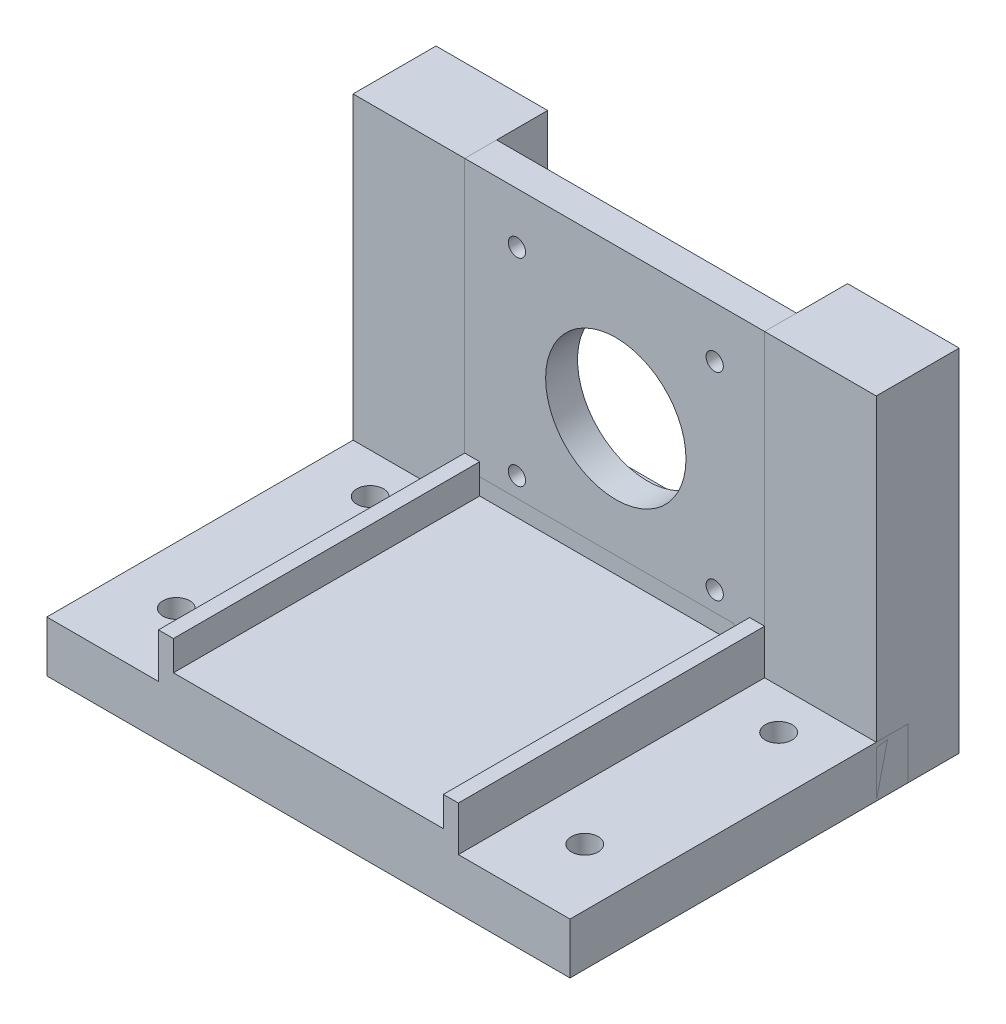
ISO-10303-21;
HEADER;
FILE_DESCRIPTION(('STEP AP214'),'2;1');
FILE_NAME('part.step','',(''),(''),'','','');
FILE_SCHEMA(('AUTOMOTIVE_DESIGN { 1 0 10303 214 1 1 1 1 }'));
ENDSEC;
DATA;
#1=APPLICATION_CONTEXT('core data for automotive mechanical design processes');
#2=APPLICATION_PROTOCOL_DEFINITION('international standard','automotive_design',2000,#1);
#3=PRODUCT_CONTEXT('',#1,'mechanical');
#4=PRODUCT('Part','Part','',(#3));
#5=PRODUCT_RELATED_PRODUCT_CATEGORY('part','',(#4));
#6=PRODUCT_DEFINITION_FORMATION('','',#4);
#7=PRODUCT_DEFINITION_CONTEXT('part definition',#1,'design');
#8=PRODUCT_DEFINITION('design','',#6,#7);
#9=PRODUCT_DEFINITION_SHAPE('','',#8);
#10=(LENGTH_UNIT() NAMED_UNIT(*) SI_UNIT(.MILLI.,.METRE.));
#11=(NAMED_UNIT(*) PLANE_ANGLE_UNIT() SI_UNIT($,.RADIAN.));
#12=(NAMED_UNIT(*) SI_UNIT($,.STERADIAN.) SOLID_ANGLE_UNIT());
#13=UNCERTAINTY_MEASURE_WITH_UNIT(LENGTH_MEASURE(1.E-05),#10,'distance_accuracy_value','');
#14=(GEOMETRIC_REPRESENTATION_CONTEXT(3) GLOBAL_UNCERTAINTY_ASSIGNED_CONTEXT((#13)) GLOBAL_UNIT_ASSIGNED_CONTEXT((#10,
#11,#12)) REPRESENTATION_CONTEXT('',''));
#15=CARTESIAN_POINT('',(0.,0.,0.));
#16=DIRECTION('',(0.,0.,1.));
#17=DIRECTION('',(1.,0.,0.));
#18=AXIS2_PLACEMENT_3D('',#15,#16,#17);
#19=CARTESIAN_POINT('',(0.,0.,-8.));
#20=DIRECTION('',(0.,0.,-1.));
#21=DIRECTION('',(-1.,0.,0.));
#22=AXIS2_PLACEMENT_3D('',#19,#20,#21);
#23=PLANE('',#22);
#24=CARTESIAN_POINT('',(-32.25,-0.427350625354143,-8.));
#25=DIRECTION('',(0.,0.,-1.));
#26=DIRECTION('',(-1.,0.,0.));
#27=AXIS2_PLACEMENT_3D('',#24,#25,#26);
#28=CIRCLE('',#27,4.09999999999999);
#29=CARTESIAN_POINT('',(-36.35,-0.427350625354143,-8.));
#30=VERTEX_POINT('',#29);
#31=EDGE_CURVE('E144',#30,#30,#28,.F.);
#32=ORIENTED_EDGE('',*,*,#31,.T.);
#33=EDGE_LOOP('',(#32));
#34=FACE_BOUND('',#33,.T.);
#35=DIRECTION('',(0.,-1.,0.));
#36=VECTOR('',#35,1.);
#37=CARTESIAN_POINT('',(41.,0.,-8.));
#38=LINE('',#37,#36);
#39=CARTESIAN_POINT('',(41.,23.5,-8.));
#40=VERTEX_POINT('',#39);
#41=CARTESIAN_POINT('',(41.,-31.5,-8.));
#42=VERTEX_POINT('',#41);
#43=EDGE_CURVE('E120',#40,#42,#38,.T.);
#44=ORIENTED_EDGE('',*,*,#43,.T.);
#45=DIRECTION('',(-1.,0.,0.));
#46=VECTOR('',#45,1.);
#47=CARTESIAN_POINT('',(0.,-31.5,-8.));
#48=LINE('',#47,#46);
#49=CARTESIAN_POINT('',(-41.,-31.5,-8.));
#50=VERTEX_POINT('',#49);
#51=EDGE_CURVE('E127',#42,#50,#48,.T.);
#52=ORIENTED_EDGE('',*,*,#51,.T.);
#53=DIRECTION('',(0.,1.,0.));
#54=VECTOR('',#53,1.);
#55=CARTESIAN_POINT('',(-41.,0.,-8.));
#56=LINE('',#55,#54);
#57=CARTESIAN_POINT('',(-41.,23.5,-8.));
#58=VERTEX_POINT('',#57);
#59=EDGE_CURVE('E133',#50,#58,#56,.T.);
#60=ORIENTED_EDGE('',*,*,#59,.T.);
#61=DIRECTION('',(-1.,0.,0.));
#62=VECTOR('',#61,1.);
#63=CARTESIAN_POINT('',(0.,23.5,-8.));
#64=LINE('',#63,#62);
#65=CARTESIAN_POINT('',(-23.5,23.5,-8.));
#66=VERTEX_POINT('',#65);
#67=EDGE_CURVE('E148',#66,#58,#64,.T.);
#68=ORIENTED_EDGE('',*,*,#67,.F.);
#69=DIRECTION('',(0.,1.,0.));
#70=VECTOR('',#69,1.);
#71=CARTESIAN_POINT('',(-23.5,0.,-8.));
#72=LINE('',#71,#70);
#73=CARTESIAN_POINT('',(-23.5,-18.5474793914732,-8.));
#74=VERTEX_POINT('',#73);
#75=EDGE_CURVE('E151',#74,#66,#72,.T.);
#76=ORIENTED_EDGE('',*,*,#75,.F.);
#77=DIRECTION('',(-1.,0.,0.));
#78=VECTOR('',#77,1.);
#79=CARTESIAN_POINT('',(0.,-18.5474793914732,-8.));
#80=LINE('',#79,#78);
#81=CARTESIAN_POINT('',(23.5,-18.5474793914732,-8.));
#82=VERTEX_POINT('',#81);
#83=EDGE_CURVE('E154',#82,#74,#80,.T.);
#84=ORIENTED_EDGE('',*,*,#83,.F.);
#85=DIRECTION('',(0.,-1.,0.));
#86=VECTOR('',#85,1.);
#87=CARTESIAN_POINT('',(23.5,0.,-8.));
#88=LINE('',#87,#86);
#89=CARTESIAN_POINT('',(23.5,23.5,-8.));
#90=VERTEX_POINT('',#89);
#91=EDGE_CURVE('E157',#90,#82,#88,.T.);
#92=ORIENTED_EDGE('',*,*,#91,.F.);
#93=DIRECTION('',(-1.,0.,0.));
#94=VECTOR('',#93,1.);
#95=CARTESIAN_POINT('',(0.,23.5,-8.));
#96=LINE('',#95,#94);
#97=EDGE_CURVE('E125',#40,#90,#96,.T.);
#98=ORIENTED_EDGE('',*,*,#97,.F.);
#99=EDGE_LOOP('',(#44,#52,#60,#68,#76,#84,#92,#98));
#100=FACE_BOUND('',#99,.T.);
#101=CARTESIAN_POINT('',(32.25,-0.42735062535415,-8.));
#102=DIRECTION('',(0.,0.,-1.));
#103=DIRECTION('',(-1.,0.,0.));
#104=AXIS2_PLACEMENT_3D('',#101,#102,#103);
#105=CIRCLE('',#104,4.1);
#106=CARTESIAN_POINT('',(28.15,-0.42735062535415,-8.));
#107=VERTEX_POINT('',#106);
#108=EDGE_CURVE('E141',#107,#107,#105,.T.);
#109=ORIENTED_EDGE('',*,*,#108,.F.);
#110=EDGE_LOOP('',(#109));
#111=FACE_BOUND('',#110,.T.);
#112=ADVANCED_FACE('F53',(#34,#100,#111),#23,.T.);
#113=CARTESIAN_POINT('',(41.,0.,103.737024463977));
#114=DIRECTION('',(1.,0.,0.));
#115=DIRECTION('',(0.,0.,-1.));
#116=AXIS2_PLACEMENT_3D('',#113,#114,#115);
#117=PLANE('',#116);
#118=DIRECTION('',(0.,1.,0.));
#119=VECTOR('',#118,1.);
#120=CARTESIAN_POINT('',(41.,0.,5.));
#121=LINE('',#120,#119);
#122=CARTESIAN_POINT('',(41.,-31.5,5.));
#123=VERTEX_POINT('',#122);
#124=CARTESIAN_POINT('',(41.,23.5,5.));
#125=VERTEX_POINT('',#124);
#126=EDGE_CURVE('E61',#123,#125,#121,.T.);
#127=ORIENTED_EDGE('',*,*,#126,.F.);
#128=DIRECTION('',(0.,0.,-1.));
#129=VECTOR('',#128,1.);
#130=CARTESIAN_POINT('',(41.,-31.5,103.737024463977));
#131=LINE('',#130,#129);
#132=EDGE_CURVE('E116',#123,#42,#131,.T.);
#133=ORIENTED_EDGE('',*,*,#132,.T.);
#134=ORIENTED_EDGE('',*,*,#43,.F.);
#135=DIRECTION('',(0.,0.,-1.));
#136=VECTOR('',#135,1.);
#137=CARTESIAN_POINT('',(41.,23.5,103.737024463977));
#138=LINE('',#137,#136);
#139=EDGE_CURVE('E163',#125,#40,#138,.T.);
#140=ORIENTED_EDGE('',*,*,#139,.F.);
#141=EDGE_LOOP('',(#127,#133,#134,#140));
#142=FACE_BOUND('',#141,.T.);
#143=ADVANCED_FACE('F55',(#142),#117,.T.);
#144=CARTESIAN_POINT('',(0.,23.5,103.737024463977));
#145=DIRECTION('',(0.,-1.,0.));
#146=DIRECTION('',(0.,0.,-1.));
#147=AXIS2_PLACEMENT_3D('',#144,#145,#146);
#148=PLANE('',#147);
#149=DIRECTION('',(0.,0.,-1.));
#150=VECTOR('',#149,1.);
#151=CARTESIAN_POINT('',(23.5,23.5,103.737024463977));
#152=LINE('',#151,#150);
#153=CARTESIAN_POINT('',(23.5,23.5,5.));
#154=VERTEX_POINT('',#153);
#155=EDGE_CURVE('E177',#154,#90,#152,.T.);
#156=ORIENTED_EDGE('',*,*,#155,.F.);
#157=DIRECTION('',(1.,0.,0.));
#158=VECTOR('',#157,1.);
#159=CARTESIAN_POINT('',(0.,23.5,5.));
#160=LINE('',#159,#158);
#161=EDGE_CURVE('E172',#154,#125,#160,.T.);
#162=ORIENTED_EDGE('',*,*,#161,.T.);
#163=ORIENTED_EDGE('',*,*,#139,.T.);
#164=ORIENTED_EDGE('',*,*,#97,.T.);
#165=EDGE_LOOP('',(#156,#162,#163,#164));
#166=FACE_BOUND('',#165,.T.);
#167=ADVANCED_FACE('F206',(#166),#148,.F.);
#168=CARTESIAN_POINT('',(23.5,0.,103.737024463977));
#169=DIRECTION('',(1.,0.,0.));
#170=DIRECTION('',(0.,0.,-1.));
#171=AXIS2_PLACEMENT_3D('',#168,#169,#170);
#172=PLANE('',#171);
#173=DIRECTION('',(0.,0.,-1.));
#174=VECTOR('',#173,1.);
#175=CARTESIAN_POINT('',(23.5,-18.5474793914732,103.737024463977));
#176=LINE('',#175,#174);
#177=CARTESIAN_POINT('',(23.5,-18.5474793914732,5.));
#178=VERTEX_POINT('',#177);
#179=EDGE_CURVE('E179',#178,#82,#176,.T.);
#180=ORIENTED_EDGE('',*,*,#179,.F.);
#181=DIRECTION('',(0.,1.,0.));
#182=VECTOR('',#181,1.);
#183=CARTESIAN_POINT('',(23.5,0.,5.));
#184=LINE('',#183,#182);
#185=EDGE_CURVE('E169',#178,#154,#184,.T.);
#186=ORIENTED_EDGE('',*,*,#185,.T.);
#187=ORIENTED_EDGE('',*,*,#155,.T.);
#188=ORIENTED_EDGE('',*,*,#91,.T.);
#189=EDGE_LOOP('',(#180,#186,#187,#188));
#190=FACE_BOUND('',#189,.T.);
#191=ADVANCED_FACE('F203',(#190),#172,.F.);
#192=CARTESIAN_POINT('',(0.,-18.5474793914732,103.737024463977));
#193=DIRECTION('',(0.,-1.,0.));
#194=DIRECTION('',(0.,0.,-1.));
#195=AXIS2_PLACEMENT_3D('',#192,#193,#194);
#196=PLANE('',#195);
#197=DIRECTION('',(0.,0.,-1.));
#198=VECTOR('',#197,1.);
#199=CARTESIAN_POINT('',(-23.5,-18.5474793914732,103.737024463977));
#200=LINE('',#199,#198);
#201=CARTESIAN_POINT('',(-23.5,-18.5474793914732,5.));
#202=VERTEX_POINT('',#201);
#203=EDGE_CURVE('E181',#202,#74,#200,.T.);
#204=ORIENTED_EDGE('',*,*,#203,.F.);
#205=DIRECTION('',(1.,0.,0.));
#206=VECTOR('',#205,1.);
#207=CARTESIAN_POINT('',(0.,-18.5474793914732,5.));
#208=LINE('',#207,#206);
#209=EDGE_CURVE('E166',#202,#178,#208,.T.);
#210=ORIENTED_EDGE('',*,*,#209,.T.);
#211=ORIENTED_EDGE('',*,*,#179,.T.);
#212=ORIENTED_EDGE('',*,*,#83,.T.);
#213=EDGE_LOOP('',(#204,#210,#211,#212));
#214=FACE_BOUND('',#213,.T.);
#215=ADVANCED_FACE('F200',(#214),#196,.F.);
#216=CARTESIAN_POINT('',(-23.5,0.,103.737024463977));
#217=DIRECTION('',(-1.,0.,0.));
#218=DIRECTION('',(0.,0.,1.));
#219=AXIS2_PLACEMENT_3D('',#216,#217,#218);
#220=PLANE('',#219);
#221=DIRECTION('',(0.,0.,-1.));
#222=VECTOR('',#221,1.);
#223=CARTESIAN_POINT('',(-23.5,23.5,103.737024463977));
#224=LINE('',#223,#222);
#225=CARTESIAN_POINT('',(-23.5,23.5,5.));
#226=VERTEX_POINT('',#225);
#227=EDGE_CURVE('E183',#226,#66,#224,.T.);
#228=ORIENTED_EDGE('',*,*,#227,.F.);
#229=DIRECTION('',(0.,-1.,0.));
#230=VECTOR('',#229,1.);
#231=CARTESIAN_POINT('',(-23.5,0.,5.));
#232=LINE('',#231,#230);
#233=EDGE_CURVE('E73',#226,#202,#232,.T.);
#234=ORIENTED_EDGE('',*,*,#233,.T.);
#235=ORIENTED_EDGE('',*,*,#203,.T.);
#236=ORIENTED_EDGE('',*,*,#75,.T.);
#237=EDGE_LOOP('',(#228,#234,#235,#236));
#238=FACE_BOUND('',#237,.T.);
#239=ADVANCED_FACE('F196',(#238),#220,.F.);
#240=CARTESIAN_POINT('',(0.,23.5,103.737024463977));
#241=DIRECTION('',(0.,-1.,0.));
#242=DIRECTION('',(0.,0.,-1.));
#243=AXIS2_PLACEMENT_3D('',#240,#241,#242);
#244=PLANE('',#243);
#245=DIRECTION('',(0.,0.,-1.));
#246=VECTOR('',#245,1.);
#247=CARTESIAN_POINT('',(-41.,23.5,103.737024463977));
#248=LINE('',#247,#246);
#249=CARTESIAN_POINT('',(-41.,23.5,5.));
#250=VERTEX_POINT('',#249);
#251=EDGE_CURVE('E185',#250,#58,#248,.T.);
#252=ORIENTED_EDGE('',*,*,#251,.F.);
#253=DIRECTION('',(1.,0.,0.));
#254=VECTOR('',#253,1.);
#255=CARTESIAN_POINT('',(0.,23.5,5.));
#256=LINE('',#255,#254);
#257=EDGE_CURVE('E68',#250,#226,#256,.T.);
#258=ORIENTED_EDGE('',*,*,#257,.T.);
#259=ORIENTED_EDGE('',*,*,#227,.T.);
#260=ORIENTED_EDGE('',*,*,#67,.T.);
#261=EDGE_LOOP('',(#252,#258,#259,#260));
#262=FACE_BOUND('',#261,.T.);
#263=ADVANCED_FACE('F193',(#262),#244,.F.);
#264=CARTESIAN_POINT('',(-41.,0.,103.737024463977));
#265=DIRECTION('',(-1.,0.,0.));
#266=DIRECTION('',(0.,0.,1.));
#267=AXIS2_PLACEMENT_3D('',#264,#265,#266);
#268=PLANE('',#267);
#269=DIRECTION('',(0.,-1.,0.));
#270=VECTOR('',#269,1.);
#271=CARTESIAN_POINT('',(-41.,0.,5.));
#272=LINE('',#271,#270);
#273=CARTESIAN_POINT('',(-41.,-31.5,5.));
#274=VERTEX_POINT('',#273);
#275=EDGE_CURVE('E161',#250,#274,#272,.T.);
#276=ORIENTED_EDGE('',*,*,#275,.F.);
#277=ORIENTED_EDGE('',*,*,#251,.T.);
#278=ORIENTED_EDGE('',*,*,#59,.F.);
#279=DIRECTION('',(0.,0.,-1.));
#280=VECTOR('',#279,1.);
#281=CARTESIAN_POINT('',(-41.,-31.5,103.737024463977));
#282=LINE('',#281,#280);
#283=EDGE_CURVE('E124',#274,#50,#282,.T.);
#284=ORIENTED_EDGE('',*,*,#283,.F.);
#285=EDGE_LOOP('',(#276,#277,#278,#284));
#286=FACE_BOUND('',#285,.T.);
#287=ADVANCED_FACE('F189',(#286),#268,.T.);
#288=CARTESIAN_POINT('',(0.,-31.5,103.737024463977));
#289=DIRECTION('',(0.,-1.,0.));
#290=DIRECTION('',(0.,0.,-1.));
#291=AXIS2_PLACEMENT_3D('',#288,#289,#290);
#292=PLANE('',#291);
#293=DIRECTION('',(1.,0.,0.));
#294=VECTOR('',#293,1.);
#295=CARTESIAN_POINT('',(0.,-31.5,5.));
#296=LINE('',#295,#294);
#297=EDGE_CURVE('E12',#274,#123,#296,.T.);
#298=ORIENTED_EDGE('',*,*,#297,.F.);
#299=ORIENTED_EDGE('',*,*,#283,.T.);
#300=ORIENTED_EDGE('',*,*,#51,.F.);
#301=ORIENTED_EDGE('',*,*,#132,.F.);
#302=EDGE_LOOP('',(#298,#299,#300,#301));
#303=FACE_BOUND('',#302,.T.);
#304=ADVANCED_FACE('F128',(#303),#292,.T.);
#305=CARTESIAN_POINT('',(0.,0.,5.));
#306=DIRECTION('',(0.,0.,-1.));
#307=DIRECTION('',(-1.,0.,0.));
#308=AXIS2_PLACEMENT_3D('',#305,#306,#307);
#309=PLANE('',#308);
#310=ORIENTED_EDGE('',*,*,#126,.T.);
#311=ORIENTED_EDGE('',*,*,#161,.F.);
#312=ORIENTED_EDGE('',*,*,#185,.F.);
#313=ORIENTED_EDGE('',*,*,#209,.F.);
#314=ORIENTED_EDGE('',*,*,#233,.F.);
#315=ORIENTED_EDGE('',*,*,#257,.F.);
#316=ORIENTED_EDGE('',*,*,#275,.T.);
#317=ORIENTED_EDGE('',*,*,#297,.T.);
#318=EDGE_LOOP('',(#310,#311,#312,#313,#314,#315,#316,#317));
#319=FACE_BOUND('',#318,.T.);
#320=ADVANCED_FACE('F207',(#319),#309,.F.);
#321=CARTESIAN_POINT('',(-32.25,-0.427350625354143,2.));
#322=DIRECTION('',(0.,0.,-1.));
#323=DIRECTION('',(-1.,0.,0.));
#324=AXIS2_PLACEMENT_3D('',#321,#322,#323);
#325=CYLINDRICAL_SURFACE('',#324,4.09999999999999);
#326=CARTESIAN_POINT('',(-32.25,-0.427350625354143,2.));
#327=DIRECTION('',(0.,0.,-1.));
#328=DIRECTION('',(-1.,0.,0.));
#329=AXIS2_PLACEMENT_3D('',#326,#327,#328);
#330=CIRCLE('',#329,4.09999999999999);
#331=CARTESIAN_POINT('',(-36.35,-0.427350625354143,2.));
#332=VERTEX_POINT('',#331);
#333=EDGE_CURVE('E243',#332,#332,#330,.F.);
#334=ORIENTED_EDGE('',*,*,#333,.T.);
#335=EDGE_LOOP('',(#334));
#336=FACE_BOUND('',#335,.T.);
#337=ORIENTED_EDGE('',*,*,#31,.F.);
#338=EDGE_LOOP('',(#337));
#339=FACE_BOUND('',#338,.T.);
#340=ADVANCED_FACE('F209',(#336,#339),#325,.F.);
#341=CARTESIAN_POINT('',(0.,0.,2.));
#342=DIRECTION('',(0.,0.,-1.));
#343=DIRECTION('',(-1.,0.,0.));
#344=AXIS2_PLACEMENT_3D('',#341,#342,#343);
#345=PLANE('',#344);
#346=ORIENTED_EDGE('',*,*,#333,.F.);
#347=EDGE_LOOP('',(#346));
#348=FACE_BOUND('',#347,.T.);
#349=ADVANCED_FACE('F215',(#348),#345,.T.);
#350=CARTESIAN_POINT('',(32.25,-0.42735062535415,2.));
#351=DIRECTION('',(0.,0.,-1.));
#352=DIRECTION('',(-1.,0.,0.));
#353=AXIS2_PLACEMENT_3D('',#350,#351,#352);
#354=CYLINDRICAL_SURFACE('',#353,4.1);
#355=CARTESIAN_POINT('',(32.25,-0.42735062535415,2.));
#356=DIRECTION('',(0.,0.,-1.));
#357=DIRECTION('',(-1.,0.,0.));
#358=AXIS2_PLACEMENT_3D('',#355,#356,#357);
#359=CIRCLE('',#358,4.1);
#360=CARTESIAN_POINT('',(28.15,-0.42735062535415,2.));
#361=VERTEX_POINT('',#360);
#362=EDGE_CURVE('E138',#361,#361,#359,.T.);
#363=ORIENTED_EDGE('',*,*,#362,.F.);
#364=EDGE_LOOP('',(#363));
#365=FACE_BOUND('',#364,.T.);
#366=ORIENTED_EDGE('',*,*,#108,.T.);
#367=EDGE_LOOP('',(#366));
#368=FACE_BOUND('',#367,.T.);
#369=ADVANCED_FACE('F229',(#365,#368),#354,.F.);
#370=CARTESIAN_POINT('',(0.,0.,2.));
#371=DIRECTION('',(0.,0.,-1.));
#372=DIRECTION('',(-1.,0.,0.));
#373=AXIS2_PLACEMENT_3D('',#370,#371,#372);
#374=PLANE('',#373);
#375=ORIENTED_EDGE('',*,*,#362,.T.);
#376=EDGE_LOOP('',(#375));
#377=FACE_BOUND('',#376,.T.);
#378=ADVANCED_FACE('F233',(#377),#374,.T.);
#379=CLOSED_SHELL('',(#112,#143,#167,#191,#215,#239,#263,#287,#304,#320,#340,#349,#369,#378));
#380=MANIFOLD_SOLID_BREP('B2',#379);
#381=CARTESIAN_POINT('',(23.5,-23.5,53.));
#382=DIRECTION('',(-1.,0.,0.));
#383=DIRECTION('',(0.,0.,1.));
#384=AXIS2_PLACEMENT_3D('',#381,#382,#383);
#385=PLANE('',#384);
#386=DIRECTION('',(0.,1.,0.));
#387=VECTOR('',#386,1.);
#388=CARTESIAN_POINT('',(23.5,-23.5,53.));
#389=LINE('',#388,#387);
#390=CARTESIAN_POINT('',(23.5,-23.5,53.));
#391=VERTEX_POINT('',#390);
#392=CARTESIAN_POINT('',(23.5,-16.5,53.));
#393=VERTEX_POINT('',#392);
#394=EDGE_CURVE('E615',#391,#393,#389,.T.);
#395=ORIENTED_EDGE('',*,*,#394,.F.);
#396=DIRECTION('',(0.,0.,-1.));
#397=VECTOR('',#396,1.);
#398=CARTESIAN_POINT('',(23.5,-23.5,53.));
#399=LINE('',#398,#397);
#400=CARTESIAN_POINT('',(23.5,-23.5,0.));
#401=VERTEX_POINT('',#400);
#402=EDGE_CURVE('E513',#391,#401,#399,.T.);
#403=ORIENTED_EDGE('',*,*,#402,.T.);
#404=DIRECTION('',(0.,1.,0.));
#405=VECTOR('',#404,1.);
#406=CARTESIAN_POINT('',(23.5,-23.5,0.));
#407=LINE('',#406,#405);
#408=CARTESIAN_POINT('',(23.5,23.5,0.));
#409=VERTEX_POINT('',#408);
#410=EDGE_CURVE('E413',#401,#409,#407,.T.);
#411=ORIENTED_EDGE('',*,*,#410,.T.);
#412=DIRECTION('',(0.,0.,-1.));
#413=VECTOR('',#412,1.);
#414=CARTESIAN_POINT('',(23.5,23.5,53.));
#415=LINE('',#414,#413);
#416=CARTESIAN_POINT('',(23.5,23.5,5.));
#417=VERTEX_POINT('',#416);
#418=EDGE_CURVE('E51',#417,#409,#415,.T.);
#419=ORIENTED_EDGE('',*,*,#418,.F.);
#420=DIRECTION('',(0.,1.,0.));
#421=VECTOR('',#420,1.);
#422=CARTESIAN_POINT('',(23.5,23.5,5.));
#423=LINE('',#422,#421);
#424=CARTESIAN_POINT('',(23.5,-16.5,4.99999999999999));
#425=VERTEX_POINT('',#424);
#426=EDGE_CURVE('E552',#425,#417,#423,.T.);
#427=ORIENTED_EDGE('',*,*,#426,.F.);
#428=DIRECTION('',(0.,0.,-1.));
#429=VECTOR('',#428,1.);
#430=CARTESIAN_POINT('',(23.5,-16.5,53.));
#431=LINE('',#430,#429);
#432=EDGE_CURVE('E549',#393,#425,#431,.T.);
#433=ORIENTED_EDGE('',*,*,#432,.F.);
#434=EDGE_LOOP('',(#395,#403,#411,#419,#427,#433));
#435=FACE_BOUND('',#434,.T.);
#436=ADVANCED_FACE('F390',(#435),#385,.F.);
#437=CARTESIAN_POINT('',(-23.5,23.5,53.));
#438=DIRECTION('',(0.,-1.,0.));
#439=DIRECTION('',(0.,0.,-1.));
#440=AXIS2_PLACEMENT_3D('',#437,#438,#439);
#441=PLANE('',#440);
#442=DIRECTION('',(0.,0.,-1.));
#443=VECTOR('',#442,1.);
#444=CARTESIAN_POINT('',(-23.5,23.5,53.));
#445=LINE('',#444,#443);
#446=CARTESIAN_POINT('',(-23.5,23.5,5.));
#447=VERTEX_POINT('',#446);
#448=CARTESIAN_POINT('',(-23.5,23.5,0.));
#449=VERTEX_POINT('',#448);
#450=EDGE_CURVE('E398',#447,#449,#445,.T.);
#451=ORIENTED_EDGE('',*,*,#450,.F.);
#452=DIRECTION('',(1.,0.,0.));
#453=VECTOR('',#452,1.);
#454=CARTESIAN_POINT('',(-24.,23.5,5.));
#455=LINE('',#454,#453);
#456=EDGE_CURVE('E555',#447,#417,#455,.T.);
#457=ORIENTED_EDGE('',*,*,#456,.T.);
#458=ORIENTED_EDGE('',*,*,#418,.T.);
#459=DIRECTION('',(-1.,0.,0.));
#460=VECTOR('',#459,1.);
#461=CARTESIAN_POINT('',(-23.5,23.5,0.));
#462=LINE('',#461,#460);
#463=EDGE_CURVE('E621',#409,#449,#462,.T.);
#464=ORIENTED_EDGE('',*,*,#463,.T.);
#465=EDGE_LOOP('',(#451,#457,#458,#464));
#466=FACE_BOUND('',#465,.T.);
#467=ADVANCED_FACE('F654',(#466),#441,.F.);
#468=CARTESIAN_POINT('',(-23.5,-23.5,53.));
#469=DIRECTION('',(1.,0.,0.));
#470=DIRECTION('',(0.,0.,-1.));
#471=AXIS2_PLACEMENT_3D('',#468,#469,#470);
#472=PLANE('',#471);
#473=DIRECTION('',(0.,-1.,0.));
#474=VECTOR('',#473,1.);
#475=CARTESIAN_POINT('',(-23.5,-23.5,0.));
#476=LINE('',#475,#474);
#477=CARTESIAN_POINT('',(-23.5,-23.5,0.));
#478=VERTEX_POINT('',#477);
#479=EDGE_CURVE('E618',#449,#478,#476,.T.);
#480=ORIENTED_EDGE('',*,*,#479,.T.);
#481=DIRECTION('',(0.,0.,1.));
#482=VECTOR('',#481,1.);
#483=CARTESIAN_POINT('',(-23.5,-23.5,53.));
#484=LINE('',#483,#482);
#485=CARTESIAN_POINT('',(-23.5,-23.5,53.));
#486=VERTEX_POINT('',#485);
#487=EDGE_CURVE('E538',#478,#486,#484,.T.);
#488=ORIENTED_EDGE('',*,*,#487,.T.);
#489=DIRECTION('',(0.,-1.,0.));
#490=VECTOR('',#489,1.);
#491=CARTESIAN_POINT('',(-23.5,-23.5,53.));
#492=LINE('',#491,#490);
#493=CARTESIAN_POINT('',(-23.5,-16.5,53.));
#494=VERTEX_POINT('',#493);
#495=EDGE_CURVE('E617',#494,#486,#492,.T.);
#496=ORIENTED_EDGE('',*,*,#495,.F.);
#497=DIRECTION('',(0.,0.,-1.));
#498=VECTOR('',#497,1.);
#499=CARTESIAN_POINT('',(-23.5,-16.5,53.));
#500=LINE('',#499,#498);
#501=CARTESIAN_POINT('',(-23.5,-16.5,4.99999999999999));
#502=VERTEX_POINT('',#501);
#503=EDGE_CURVE('E572',#494,#502,#500,.T.);
#504=ORIENTED_EDGE('',*,*,#503,.T.);
#505=DIRECTION('',(0.,1.,0.));
#506=VECTOR('',#505,1.);
#507=CARTESIAN_POINT('',(-23.5,-23.5,4.99999999999999));
#508=LINE('',#507,#506);
#509=EDGE_CURVE('E558',#502,#447,#508,.T.);
#510=ORIENTED_EDGE('',*,*,#509,.T.);
#511=ORIENTED_EDGE('',*,*,#450,.T.);
#512=EDGE_LOOP('',(#480,#488,#496,#504,#510,#511));
#513=FACE_BOUND('',#512,.T.);
#514=ADVANCED_FACE('F658',(#513),#472,.F.);
#515=CARTESIAN_POINT('',(0.,0.,53.));
#516=DIRECTION('',(0.,0.,-1.));
#517=DIRECTION('',(-1.,0.,0.));
#518=AXIS2_PLACEMENT_3D('',#515,#516,#517);
#519=PLANE('',#518);
#520=ORIENTED_EDGE('',*,*,#495,.T.);
#521=DIRECTION('',(-1.,0.,0.));
#522=VECTOR('',#521,1.);
#523=CARTESIAN_POINT('',(-41.,-23.5,53.));
#524=LINE('',#523,#522);
#525=CARTESIAN_POINT('',(-41.,-23.5,53.));
#526=VERTEX_POINT('',#525);
#527=EDGE_CURVE('E515',#486,#526,#524,.T.);
#528=ORIENTED_EDGE('',*,*,#527,.T.);
#529=DIRECTION('',(0.,-1.,0.));
#530=VECTOR('',#529,1.);
#531=CARTESIAN_POINT('',(-41.,-23.5,53.));
#532=LINE('',#531,#530);
#533=CARTESIAN_POINT('',(-41.,-31.5,53.));
#534=VERTEX_POINT('',#533);
#535=EDGE_CURVE('E506',#526,#534,#532,.T.);
#536=ORIENTED_EDGE('',*,*,#535,.T.);
#537=DIRECTION('',(-1.,0.,0.));
#538=VECTOR('',#537,1.);
#539=CARTESIAN_POINT('',(-23.5,-31.5,53.));
#540=LINE('',#539,#538);
#541=CARTESIAN_POINT('',(41.,-31.5,53.));
#542=VERTEX_POINT('',#541);
#543=EDGE_CURVE('E501',#542,#534,#540,.T.);
#544=ORIENTED_EDGE('',*,*,#543,.F.);
#545=DIRECTION('',(0.,-1.,0.));
#546=VECTOR('',#545,1.);
#547=CARTESIAN_POINT('',(41.,-23.5,53.));
#548=LINE('',#547,#546);
#549=CARTESIAN_POINT('',(41.,-23.5,53.));
#550=VERTEX_POINT('',#549);
#551=EDGE_CURVE('E494',#550,#542,#548,.T.);
#552=ORIENTED_EDGE('',*,*,#551,.F.);
#553=EDGE_CURVE('E498',#550,#391,#524,.T.);
#554=ORIENTED_EDGE('',*,*,#553,.T.);
#555=ORIENTED_EDGE('',*,*,#394,.T.);
#556=DIRECTION('',(1.,0.,0.));
#557=VECTOR('',#556,1.);
#558=CARTESIAN_POINT('',(-24.,-16.5,53.));
#559=LINE('',#558,#557);
#560=CARTESIAN_POINT('',(21.15,-16.5,53.));
#561=VERTEX_POINT('',#560);
#562=EDGE_CURVE('E554',#561,#393,#559,.T.);
#563=ORIENTED_EDGE('',*,*,#562,.F.);
#564=DIRECTION('',(0.,1.,0.));
#565=VECTOR('',#564,1.);
#566=CARTESIAN_POINT('',(21.15,-21.15,53.));
#567=LINE('',#566,#565);
#568=CARTESIAN_POINT('',(21.15,-21.15,53.));
#569=VERTEX_POINT('',#568);
#570=EDGE_CURVE('E604',#569,#561,#567,.T.);
#571=ORIENTED_EDGE('',*,*,#570,.F.);
#572=DIRECTION('',(1.,0.,0.));
#573=VECTOR('',#572,1.);
#574=CARTESIAN_POINT('',(-21.15,-21.15,53.));
#575=LINE('',#574,#573);
#576=CARTESIAN_POINT('',(-21.15,-21.15,53.));
#577=VERTEX_POINT('',#576);
#578=EDGE_CURVE('E598',#577,#569,#575,.T.);
#579=ORIENTED_EDGE('',*,*,#578,.F.);
#580=DIRECTION('',(0.,-1.,0.));
#581=VECTOR('',#580,1.);
#582=CARTESIAN_POINT('',(-21.15,-21.15,53.));
#583=LINE('',#582,#581);
#584=CARTESIAN_POINT('',(-21.15,-16.5,53.));
#585=VERTEX_POINT('',#584);
#586=EDGE_CURVE('E607',#585,#577,#583,.T.);
#587=ORIENTED_EDGE('',*,*,#586,.F.);
#588=EDGE_CURVE('E562',#494,#585,#559,.T.);
#589=ORIENTED_EDGE('',*,*,#588,.F.);
#590=EDGE_LOOP('',(#520,#528,#536,#544,#552,#554,#555,#563,#571,#579,#587,#589));
#591=FACE_BOUND('',#590,.T.);
#592=ADVANCED_FACE('F497',(#591),#519,.F.);
#593=CARTESIAN_POINT('',(0.,0.,0.));
#594=DIRECTION('',(0.,0.,-1.));
#595=DIRECTION('',(-1.,0.,0.));
#596=AXIS2_PLACEMENT_3D('',#593,#594,#595);
#597=PLANE('',#596);
#598=ORIENTED_EDGE('',*,*,#410,.F.);
#599=DIRECTION('',(1.,0.,0.));
#600=VECTOR('',#599,1.);
#601=CARTESIAN_POINT('',(-41.,-23.5,0.));
#602=LINE('',#601,#600);
#603=CARTESIAN_POINT('',(41.,-23.5,0.));
#604=VERTEX_POINT('',#603);
#605=EDGE_CURVE('E532',#401,#604,#602,.T.);
#606=ORIENTED_EDGE('',*,*,#605,.T.);
#607=DIRECTION('',(0.,-1.,0.));
#608=VECTOR('',#607,1.);
#609=CARTESIAN_POINT('',(41.,-23.5,0.));
#610=LINE('',#609,#608);
#611=CARTESIAN_POINT('',(41.,-31.5,0.));
#612=VERTEX_POINT('',#611);
#613=EDGE_CURVE('E520',#604,#612,#610,.T.);
#614=ORIENTED_EDGE('',*,*,#613,.T.);
#615=DIRECTION('',(1.,0.,0.));
#616=VECTOR('',#615,1.);
#617=CARTESIAN_POINT('',(-23.5,-31.5,0.));
#618=LINE('',#617,#616);
#619=CARTESIAN_POINT('',(-41.,-31.5,0.));
#620=VERTEX_POINT('',#619);
#621=EDGE_CURVE('E546',#620,#612,#618,.T.);
#622=ORIENTED_EDGE('',*,*,#621,.F.);
#623=DIRECTION('',(0.,-1.,0.));
#624=VECTOR('',#623,1.);
#625=CARTESIAN_POINT('',(-41.,-23.5,0.));
#626=LINE('',#625,#624);
#627=CARTESIAN_POINT('',(-41.,-23.5,0.));
#628=VERTEX_POINT('',#627);
#629=EDGE_CURVE('E539',#628,#620,#626,.T.);
#630=ORIENTED_EDGE('',*,*,#629,.F.);
#631=EDGE_CURVE('E507',#628,#478,#602,.T.);
#632=ORIENTED_EDGE('',*,*,#631,.T.);
#633=ORIENTED_EDGE('',*,*,#479,.F.);
#634=ORIENTED_EDGE('',*,*,#463,.F.);
#635=EDGE_LOOP('',(#598,#606,#614,#622,#630,#632,#633,#634));
#636=FACE_BOUND('',#635,.T.);
#637=CARTESIAN_POINT('',(-15.321257734351,-15.4773506253541,0.));
#638=DIRECTION('',(0.,0.,1.));
#639=DIRECTION('',(-1.,0.,0.));
#640=AXIS2_PLACEMENT_3D('',#637,#638,#639);
#641=CIRCLE('',#640,1.35);
#642=CARTESIAN_POINT('',(-16.671257734351,-15.4773506253541,0.));
#643=VERTEX_POINT('',#642);
#644=EDGE_CURVE('E575',#643,#643,#641,.T.);
#645=ORIENTED_EDGE('',*,*,#644,.T.);
#646=EDGE_LOOP('',(#645));
#647=FACE_BOUND('',#646,.T.);
#648=CARTESIAN_POINT('',(15.678742265649,-15.4773506253541,0.));
#649=DIRECTION('',(0.,0.,1.));
#650=DIRECTION('',(1.,0.,0.));
#651=AXIS2_PLACEMENT_3D('',#648,#649,#650);
#652=CIRCLE('',#651,1.35);
#653=CARTESIAN_POINT('',(17.028742265649,-15.4773506253541,0.));
#654=VERTEX_POINT('',#653);
#655=EDGE_CURVE('E578',#654,#654,#652,.T.);
#656=ORIENTED_EDGE('',*,*,#655,.T.);
#657=EDGE_LOOP('',(#656));
#658=FACE_BOUND('',#657,.T.);
#659=CARTESIAN_POINT('',(15.678742265649,15.5226493746459,0.));
#660=DIRECTION('',(0.,0.,1.));
#661=DIRECTION('',(-1.,0.,0.));
#662=AXIS2_PLACEMENT_3D('',#659,#660,#661);
#663=CIRCLE('',#662,1.35);
#664=CARTESIAN_POINT('',(14.328742265649,15.5226493746459,0.));
#665=VERTEX_POINT('',#664);
#666=EDGE_CURVE('E582',#665,#665,#663,.T.);
#667=ORIENTED_EDGE('',*,*,#666,.T.);
#668=EDGE_LOOP('',(#667));
#669=FACE_BOUND('',#668,.T.);
#670=CARTESIAN_POINT('',(-15.321257734351,15.5226493746459,0.));
#671=DIRECTION('',(0.,0.,1.));
#672=DIRECTION('',(1.,0.,0.));
#673=AXIS2_PLACEMENT_3D('',#670,#671,#672);
#674=CIRCLE('',#673,1.35);
#675=CARTESIAN_POINT('',(-13.971257734351,15.5226493746459,0.));
#676=VERTEX_POINT('',#675);
#677=EDGE_CURVE('E586',#676,#676,#674,.T.);
#678=ORIENTED_EDGE('',*,*,#677,.T.);
#679=EDGE_LOOP('',(#678));
#680=FACE_BOUND('',#679,.T.);
#681=CARTESIAN_POINT('',(0.178742265649005,0.0226493746458712,0.));
#682=DIRECTION('',(0.,0.,1.));
#683=DIRECTION('',(1.,0.,0.));
#684=AXIS2_PLACEMENT_3D('',#681,#682,#683);
#685=CIRCLE('',#684,11.);
#686=CARTESIAN_POINT('',(11.178742265649,0.0226493746458712,0.));
#687=VERTEX_POINT('',#686);
#688=EDGE_CURVE('E590',#687,#687,#685,.T.);
#689=ORIENTED_EDGE('',*,*,#688,.T.);
#690=EDGE_LOOP('',(#689));
#691=FACE_BOUND('',#690,.T.);
#692=ADVANCED_FACE('F687',(#636,#647,#658,#669,#680,#691),#597,.T.);
#693=CARTESIAN_POINT('',(21.15,-21.15,5.));
#694=DIRECTION('',(1.,0.,0.));
#695=DIRECTION('',(0.,0.,-1.));
#696=AXIS2_PLACEMENT_3D('',#693,#694,#695);
#697=PLANE('',#696);
#698=ORIENTED_EDGE('',*,*,#570,.T.);
#699=DIRECTION('',(0.,0.,-1.));
#700=VECTOR('',#699,1.);
#701=CARTESIAN_POINT('',(21.15,-16.5,5.));
#702=LINE('',#701,#700);
#703=CARTESIAN_POINT('',(21.15,-16.5,4.99999999999999));
#704=VERTEX_POINT('',#703);
#705=EDGE_CURVE('E569',#561,#704,#702,.T.);
#706=ORIENTED_EDGE('',*,*,#705,.T.);
#707=DIRECTION('',(0.,1.,0.));
#708=VECTOR('',#707,1.);
#709=CARTESIAN_POINT('',(21.15,-21.15,5.));
#710=LINE('',#709,#708);
#711=CARTESIAN_POINT('',(21.15,-21.15,5.));
#712=VERTEX_POINT('',#711);
#713=EDGE_CURVE('E594',#712,#704,#710,.T.);
#714=ORIENTED_EDGE('',*,*,#713,.F.);
#715=DIRECTION('',(0.,0.,1.));
#716=VECTOR('',#715,1.);
#717=CARTESIAN_POINT('',(21.15,-21.15,5.));
#718=LINE('',#717,#716);
#719=EDGE_CURVE('E611',#712,#569,#718,.T.);
#720=ORIENTED_EDGE('',*,*,#719,.T.);
#721=EDGE_LOOP('',(#698,#706,#714,#720));
#722=FACE_BOUND('',#721,.T.);
#723=ADVANCED_FACE('F668',(#722),#697,.F.);
#724=CARTESIAN_POINT('',(-21.15,-21.15,5.));
#725=DIRECTION('',(0.,-1.,0.));
#726=DIRECTION('',(0.,0.,-1.));
#727=AXIS2_PLACEMENT_3D('',#724,#725,#726);
#728=PLANE('',#727);
#729=ORIENTED_EDGE('',*,*,#578,.T.);
#730=ORIENTED_EDGE('',*,*,#719,.F.);
#731=DIRECTION('',(1.,0.,0.));
#732=VECTOR('',#731,1.);
#733=CARTESIAN_POINT('',(-21.15,-21.15,5.));
#734=LINE('',#733,#732);
#735=CARTESIAN_POINT('',(-21.15,-21.15,5.));
#736=VERTEX_POINT('',#735);
#737=EDGE_CURVE('E600',#736,#712,#734,.T.);
#738=ORIENTED_EDGE('',*,*,#737,.F.);
#739=DIRECTION('',(0.,0.,1.));
#740=VECTOR('',#739,1.);
#741=CARTESIAN_POINT('',(-21.15,-21.15,5.));
#742=LINE('',#741,#740);
#743=EDGE_CURVE('E603',#736,#577,#742,.T.);
#744=ORIENTED_EDGE('',*,*,#743,.T.);
#745=EDGE_LOOP('',(#729,#730,#738,#744));
#746=FACE_BOUND('',#745,.T.);
#747=ADVANCED_FACE('F675',(#746),#728,.F.);
#748=CARTESIAN_POINT('',(-21.15,-21.15,5.));
#749=DIRECTION('',(-1.,0.,0.));
#750=DIRECTION('',(0.,0.,1.));
#751=AXIS2_PLACEMENT_3D('',#748,#749,#750);
#752=PLANE('',#751);
#753=DIRECTION('',(0.,-1.,0.));
#754=VECTOR('',#753,1.);
#755=CARTESIAN_POINT('',(-21.15,-21.15,5.));
#756=LINE('',#755,#754);
#757=CARTESIAN_POINT('',(-21.15,-16.5,4.99999999999999));
#758=VERTEX_POINT('',#757);
#759=EDGE_CURVE('E597',#758,#736,#756,.T.);
#760=ORIENTED_EDGE('',*,*,#759,.F.);
#761=DIRECTION('',(0.,0.,1.));
#762=VECTOR('',#761,1.);
#763=CARTESIAN_POINT('',(-21.15,-16.5,5.));
#764=LINE('',#763,#762);
#765=EDGE_CURVE('E566',#758,#585,#764,.T.);
#766=ORIENTED_EDGE('',*,*,#765,.T.);
#767=ORIENTED_EDGE('',*,*,#586,.T.);
#768=ORIENTED_EDGE('',*,*,#743,.F.);
#769=EDGE_LOOP('',(#760,#766,#767,#768));
#770=FACE_BOUND('',#769,.T.);
#771=ADVANCED_FACE('F681',(#770),#752,.F.);
#772=CARTESIAN_POINT('',(0.,0.,5.));
#773=DIRECTION('',(0.,0.,-1.));
#774=DIRECTION('',(-1.,0.,0.));
#775=AXIS2_PLACEMENT_3D('',#772,#773,#774);
#776=PLANE('',#775);
#777=DIRECTION('',(1.,0.,0.));
#778=VECTOR('',#777,1.);
#779=CARTESIAN_POINT('',(-24.,-16.5,4.99999999999999));
#780=LINE('',#779,#778);
#781=EDGE_CURVE('E559',#502,#758,#780,.T.);
#782=ORIENTED_EDGE('',*,*,#781,.T.);
#783=ORIENTED_EDGE('',*,*,#759,.T.);
#784=ORIENTED_EDGE('',*,*,#737,.T.);
#785=ORIENTED_EDGE('',*,*,#713,.T.);
#786=EDGE_CURVE('E560',#704,#425,#780,.T.);
#787=ORIENTED_EDGE('',*,*,#786,.T.);
#788=ORIENTED_EDGE('',*,*,#426,.T.);
#789=ORIENTED_EDGE('',*,*,#456,.F.);
#790=ORIENTED_EDGE('',*,*,#509,.F.);
#791=EDGE_LOOP('',(#782,#783,#784,#785,#787,#788,#789,#790));
#792=FACE_BOUND('',#791,.T.);
#793=CARTESIAN_POINT('',(15.678742265649,-15.4773506253541,5.));
#794=DIRECTION('',(0.,0.,-1.));
#795=DIRECTION('',(-1.,0.,0.));
#796=AXIS2_PLACEMENT_3D('',#793,#794,#795);
#797=CIRCLE('',#796,1.35);
#798=CARTESIAN_POINT('',(14.328742265649,-15.4773506253541,5.));
#799=VERTEX_POINT('',#798);
#800=EDGE_CURVE('E581',#799,#799,#797,.T.);
#801=ORIENTED_EDGE('',*,*,#800,.T.);
#802=EDGE_LOOP('',(#801));
#803=FACE_BOUND('',#802,.T.);
#804=CARTESIAN_POINT('',(-15.321257734351,-15.4773506253541,5.));
#805=DIRECTION('',(0.,0.,-1.));
#806=DIRECTION('',(-1.,0.,0.));
#807=AXIS2_PLACEMENT_3D('',#804,#805,#806);
#808=CIRCLE('',#807,1.35);
#809=CARTESIAN_POINT('',(-16.671257734351,-15.4773506253541,5.));
#810=VERTEX_POINT('',#809);
#811=EDGE_CURVE('E393',#810,#810,#808,.T.);
#812=ORIENTED_EDGE('',*,*,#811,.T.);
#813=EDGE_LOOP('',(#812));
#814=FACE_BOUND('',#813,.T.);
#815=CARTESIAN_POINT('',(0.178742265649005,0.0226493746458712,5.));
#816=DIRECTION('',(0.,0.,-1.));
#817=DIRECTION('',(-1.,0.,0.));
#818=AXIS2_PLACEMENT_3D('',#815,#816,#817);
#819=CIRCLE('',#818,11.);
#820=CARTESIAN_POINT('',(-10.821257734351,0.0226493746458712,5.));
#821=VERTEX_POINT('',#820);
#822=EDGE_CURVE('E593',#821,#821,#819,.T.);
#823=ORIENTED_EDGE('',*,*,#822,.T.);
#824=EDGE_LOOP('',(#823));
#825=FACE_BOUND('',#824,.T.);
#826=CARTESIAN_POINT('',(-15.321257734351,15.5226493746459,5.));
#827=DIRECTION('',(0.,0.,-1.));
#828=DIRECTION('',(-1.,0.,0.));
#829=AXIS2_PLACEMENT_3D('',#826,#827,#828);
#830=CIRCLE('',#829,1.35);
#831=CARTESIAN_POINT('',(-16.671257734351,15.5226493746459,5.));
#832=VERTEX_POINT('',#831);
#833=EDGE_CURVE('E589',#832,#832,#830,.T.);
#834=ORIENTED_EDGE('',*,*,#833,.T.);
#835=EDGE_LOOP('',(#834));
#836=FACE_BOUND('',#835,.T.);
#837=CARTESIAN_POINT('',(15.678742265649,15.5226493746459,5.));
#838=DIRECTION('',(0.,0.,-1.));
#839=DIRECTION('',(-1.,0.,0.));
#840=AXIS2_PLACEMENT_3D('',#837,#838,#839);
#841=CIRCLE('',#840,1.35);
#842=CARTESIAN_POINT('',(14.328742265649,15.5226493746459,5.));
#843=VERTEX_POINT('',#842);
#844=EDGE_CURVE('E585',#843,#843,#841,.T.);
#845=ORIENTED_EDGE('',*,*,#844,.T.);
#846=EDGE_LOOP('',(#845));
#847=FACE_BOUND('',#846,.T.);
#848=ADVANCED_FACE('F633',(#792,#803,#814,#825,#836,#847),#776,.F.);
#849=CARTESIAN_POINT('',(0.178742265649005,0.0226493746458712,0.));
#850=DIRECTION('',(0.,0.,1.));
#851=DIRECTION('',(1.,0.,0.));
#852=AXIS2_PLACEMENT_3D('',#849,#850,#851);
#853=CYLINDRICAL_SURFACE('',#852,11.);
#854=ORIENTED_EDGE('',*,*,#688,.F.);
#855=EDGE_LOOP('',(#854));
#856=FACE_BOUND('',#855,.T.);
#857=ORIENTED_EDGE('',*,*,#822,.F.);
#858=EDGE_LOOP('',(#857));
#859=FACE_BOUND('',#858,.T.);
#860=ADVANCED_FACE('F886',(#856,#859),#853,.F.);
#861=CARTESIAN_POINT('',(-15.321257734351,15.5226493746459,0.));
#862=DIRECTION('',(0.,0.,1.));
#863=DIRECTION('',(1.,0.,0.));
#864=AXIS2_PLACEMENT_3D('',#861,#862,#863);
#865=CYLINDRICAL_SURFACE('',#864,1.35);
#866=ORIENTED_EDGE('',*,*,#677,.F.);
#867=EDGE_LOOP('',(#866));
#868=FACE_BOUND('',#867,.T.);
#869=ORIENTED_EDGE('',*,*,#833,.F.);
#870=EDGE_LOOP('',(#869));
#871=FACE_BOUND('',#870,.T.);
#872=ADVANCED_FACE('F649',(#868,#871),#865,.F.);
#873=CARTESIAN_POINT('',(15.678742265649,15.5226493746459,0.));
#874=DIRECTION('',(0.,0.,1.));
#875=DIRECTION('',(1.,0.,0.));
#876=AXIS2_PLACEMENT_3D('',#873,#874,#875);
#877=CYLINDRICAL_SURFACE('',#876,1.35);
#878=ORIENTED_EDGE('',*,*,#666,.F.);
#879=EDGE_LOOP('',(#878));
#880=FACE_BOUND('',#879,.T.);
#881=ORIENTED_EDGE('',*,*,#844,.F.);
#882=EDGE_LOOP('',(#881));
#883=FACE_BOUND('',#882,.T.);
#884=ADVANCED_FACE('F639',(#880,#883),#877,.F.);
#885=CARTESIAN_POINT('',(15.678742265649,-15.4773506253541,0.));
#886=DIRECTION('',(0.,0.,1.));
#887=DIRECTION('',(1.,0.,0.));
#888=AXIS2_PLACEMENT_3D('',#885,#886,#887);
#889=CYLINDRICAL_SURFACE('',#888,1.35);
#890=ORIENTED_EDGE('',*,*,#655,.F.);
#891=EDGE_LOOP('',(#890));
#892=FACE_BOUND('',#891,.T.);
#893=ORIENTED_EDGE('',*,*,#800,.F.);
#894=EDGE_LOOP('',(#893));
#895=FACE_BOUND('',#894,.T.);
#896=ADVANCED_FACE('F636',(#892,#895),#889,.F.);
#897=CARTESIAN_POINT('',(-15.321257734351,-15.4773506253541,0.));
#898=DIRECTION('',(0.,0.,1.));
#899=DIRECTION('',(1.,0.,0.));
#900=AXIS2_PLACEMENT_3D('',#897,#898,#899);
#901=CYLINDRICAL_SURFACE('',#900,1.35);
#902=ORIENTED_EDGE('',*,*,#644,.F.);
#903=EDGE_LOOP('',(#902));
#904=FACE_BOUND('',#903,.T.);
#905=ORIENTED_EDGE('',*,*,#811,.F.);
#906=EDGE_LOOP('',(#905));
#907=FACE_BOUND('',#906,.T.);
#908=ADVANCED_FACE('F638',(#904,#907),#901,.F.);
#909=CARTESIAN_POINT('',(-24.,-16.5,53.));
#910=DIRECTION('',(0.,-1.,0.));
#911=DIRECTION('',(0.,0.,-1.));
#912=AXIS2_PLACEMENT_3D('',#909,#910,#911);
#913=PLANE('',#912);
#914=ORIENTED_EDGE('',*,*,#588,.T.);
#915=ORIENTED_EDGE('',*,*,#765,.F.);
#916=ORIENTED_EDGE('',*,*,#781,.F.);
#917=ORIENTED_EDGE('',*,*,#503,.F.);
#918=EDGE_LOOP('',(#914,#915,#916,#917));
#919=FACE_BOUND('',#918,.T.);
#920=ADVANCED_FACE('F646',(#919),#913,.F.);
#921=ORIENTED_EDGE('',*,*,#562,.T.);
#922=ORIENTED_EDGE('',*,*,#432,.T.);
#923=ORIENTED_EDGE('',*,*,#786,.F.);
#924=ORIENTED_EDGE('',*,*,#705,.F.);
#925=EDGE_LOOP('',(#921,#922,#923,#924));
#926=FACE_BOUND('',#925,.T.);
#927=ADVANCED_FACE('F665',(#926),#913,.F.);
#928=CARTESIAN_POINT('',(0.,-31.5,0.));
#929=DIRECTION('',(0.,-1.,0.));
#930=DIRECTION('',(0.,0.,-1.));
#931=AXIS2_PLACEMENT_3D('',#928,#929,#930);
#932=PLANE('',#931);
#933=ORIENTED_EDGE('',*,*,#543,.T.);
#934=DIRECTION('',(0.,0.,-1.));
#935=VECTOR('',#934,1.);
#936=CARTESIAN_POINT('',(-41.,-31.5,0.));
#937=LINE('',#936,#935);
#938=EDGE_CURVE('E521',#534,#620,#937,.T.);
#939=ORIENTED_EDGE('',*,*,#938,.T.);
#940=ORIENTED_EDGE('',*,*,#621,.T.);
#941=DIRECTION('',(0.,0.,1.));
#942=VECTOR('',#941,1.);
#943=CARTESIAN_POINT('',(41.,-31.5,0.));
#944=LINE('',#943,#942);
#945=EDGE_CURVE('E524',#612,#542,#944,.T.);
#946=ORIENTED_EDGE('',*,*,#945,.T.);
#947=EDGE_LOOP('',(#933,#939,#940,#946));
#948=FACE_BOUND('',#947,.T.);
#949=CARTESIAN_POINT('',(-32.0085422645588,-31.5,41.6925133814835));
#950=DIRECTION('',(0.,-1.,0.));
#951=DIRECTION('',(0.,0.,-1.));
#952=AXIS2_PLACEMENT_3D('',#949,#950,#951);
#953=CIRCLE('',#952,2.1);
#954=CARTESIAN_POINT('',(-32.0085422645588,-31.5,39.5925133814835));
#955=VERTEX_POINT('',#954);
#956=EDGE_CURVE('E527',#955,#955,#953,.T.);
#957=ORIENTED_EDGE('',*,*,#956,.F.);
#958=EDGE_LOOP('',(#957));
#959=FACE_BOUND('',#958,.T.);
#960=CARTESIAN_POINT('',(-32.0085422645588,-31.5,11.3074866185165));
#961=DIRECTION('',(0.,-1.,0.));
#962=DIRECTION('',(0.,0.,1.));
#963=AXIS2_PLACEMENT_3D('',#960,#961,#962);
#964=CIRCLE('',#963,2.1);
#965=CARTESIAN_POINT('',(-32.0085422645588,-31.5,13.4074866185165));
#966=VERTEX_POINT('',#965);
#967=EDGE_CURVE('E998',#966,#966,#964,.T.);
#968=ORIENTED_EDGE('',*,*,#967,.F.);
#969=EDGE_LOOP('',(#968));
#970=FACE_BOUND('',#969,.T.);
#971=CARTESIAN_POINT('',(32.0085422645588,-31.5,41.6925133814835));
#972=DIRECTION('',(0.,-1.,0.));
#973=DIRECTION('',(0.,0.,1.));
#974=AXIS2_PLACEMENT_3D('',#971,#972,#973);
#975=CIRCLE('',#974,2.1);
#976=CARTESIAN_POINT('',(32.0085422645588,-31.5,43.7925133814835));
#977=VERTEX_POINT('',#976);
#978=EDGE_CURVE('E989',#977,#977,#975,.T.);
#979=ORIENTED_EDGE('',*,*,#978,.F.);
#980=EDGE_LOOP('',(#979));
#981=FACE_BOUND('',#980,.T.);
#982=CARTESIAN_POINT('',(32.0085422645588,-31.5,11.3074866185165));
#983=DIRECTION('',(0.,-1.,0.));
#984=DIRECTION('',(0.,0.,-1.));
#985=AXIS2_PLACEMENT_3D('',#982,#983,#984);
#986=CIRCLE('',#985,2.1);
#987=CARTESIAN_POINT('',(32.0085422645588,-31.5,9.20748661851648));
#988=VERTEX_POINT('',#987);
#989=EDGE_CURVE('E992',#988,#988,#986,.T.);
#990=ORIENTED_EDGE('',*,*,#989,.F.);
#991=EDGE_LOOP('',(#990));
#992=FACE_BOUND('',#991,.T.);
#993=ADVANCED_FACE('F715',(#948,#959,#970,#981,#992),#932,.T.);
#994=CARTESIAN_POINT('',(-41.,-23.5,0.));
#995=DIRECTION('',(-1.,0.,0.));
#996=DIRECTION('',(0.,0.,1.));
#997=AXIS2_PLACEMENT_3D('',#994,#995,#996);
#998=PLANE('',#997);
#999=ORIENTED_EDGE('',*,*,#938,.F.);
#1000=ORIENTED_EDGE('',*,*,#535,.F.);
#1001=DIRECTION('',(0.,0.,-1.));
#1002=VECTOR('',#1001,1.);
#1003=CARTESIAN_POINT('',(-41.,-23.5,0.));
#1004=LINE('',#1003,#1002);
#1005=EDGE_CURVE('E514',#526,#628,#1004,.T.);
#1006=ORIENTED_EDGE('',*,*,#1005,.T.);
#1007=ORIENTED_EDGE('',*,*,#629,.T.);
#1008=EDGE_LOOP('',(#999,#1000,#1006,#1007));
#1009=FACE_BOUND('',#1008,.T.);
#1010=ADVANCED_FACE('F695',(#1009),#998,.T.);
#1011=CARTESIAN_POINT('',(-32.0085422645588,-23.5,11.3074866185165));
#1012=DIRECTION('',(0.,-1.,0.));
#1013=DIRECTION('',(0.,0.,-1.));
#1014=AXIS2_PLACEMENT_3D('',#1011,#1012,#1013);
#1015=CYLINDRICAL_SURFACE('',#1014,2.1);
#1016=CARTESIAN_POINT('',(-32.0085422645588,-23.5,11.3074866185165));
#1017=DIRECTION('',(0.,-1.,0.));
#1018=DIRECTION('',(0.,0.,1.));
#1019=AXIS2_PLACEMENT_3D('',#1016,#1017,#1018);
#1020=CIRCLE('',#1019,2.1);
#1021=CARTESIAN_POINT('',(-32.0085422645588,-23.5,13.4074866185165));
#1022=VERTEX_POINT('',#1021);
#1023=EDGE_CURVE('E1001',#1022,#1022,#1020,.T.);
#1024=ORIENTED_EDGE('',*,*,#1023,.F.);
#1025=EDGE_LOOP('',(#1024));
#1026=FACE_BOUND('',#1025,.T.);
#1027=ORIENTED_EDGE('',*,*,#967,.T.);
#1028=EDGE_LOOP('',(#1027));
#1029=FACE_BOUND('',#1028,.T.);
#1030=ADVANCED_FACE('F706',(#1026,#1029),#1015,.F.);
#1031=CARTESIAN_POINT('',(-32.0085422645588,-23.5,41.6925133814835));
#1032=DIRECTION('',(0.,-1.,0.));
#1033=DIRECTION('',(0.,0.,-1.));
#1034=AXIS2_PLACEMENT_3D('',#1031,#1032,#1033);
#1035=CYLINDRICAL_SURFACE('',#1034,2.1);
#1036=CARTESIAN_POINT('',(-32.0085422645588,-23.5,41.6925133814835));
#1037=DIRECTION('',(0.,-1.,0.));
#1038=DIRECTION('',(0.,0.,-1.));
#1039=AXIS2_PLACEMENT_3D('',#1036,#1037,#1038);
#1040=CIRCLE('',#1039,2.1);
#1041=CARTESIAN_POINT('',(-32.0085422645588,-23.5,39.5925133814835));
#1042=VERTEX_POINT('',#1041);
#1043=EDGE_CURVE('E535',#1042,#1042,#1040,.T.);
#1044=ORIENTED_EDGE('',*,*,#1043,.F.);
#1045=EDGE_LOOP('',(#1044));
#1046=FACE_BOUND('',#1045,.T.);
#1047=ORIENTED_EDGE('',*,*,#956,.T.);
#1048=EDGE_LOOP('',(#1047));
#1049=FACE_BOUND('',#1048,.T.);
#1050=ADVANCED_FACE('F698',(#1046,#1049),#1035,.F.);
#1051=CARTESIAN_POINT('',(0.,-23.5,0.));
#1052=DIRECTION('',(0.,1.,0.));
#1053=DIRECTION('',(0.,0.,1.));
#1054=AXIS2_PLACEMENT_3D('',#1051,#1052,#1053);
#1055=PLANE('',#1054);
#1056=ORIENTED_EDGE('',*,*,#1043,.T.);
#1057=EDGE_LOOP('',(#1056));
#1058=FACE_BOUND('',#1057,.T.);
#1059=ORIENTED_EDGE('',*,*,#1023,.T.);
#1060=EDGE_LOOP('',(#1059));
#1061=FACE_BOUND('',#1060,.T.);
#1062=ORIENTED_EDGE('',*,*,#487,.F.);
#1063=ORIENTED_EDGE('',*,*,#631,.F.);
#1064=ORIENTED_EDGE('',*,*,#1005,.F.);
#1065=ORIENTED_EDGE('',*,*,#527,.F.);
#1066=EDGE_LOOP('',(#1062,#1063,#1064,#1065));
#1067=FACE_BOUND('',#1066,.T.);
#1068=ADVANCED_FACE('F696',(#1058,#1061,#1067),#1055,.T.);
#1069=CARTESIAN_POINT('',(32.0085422645588,-23.5,11.3074866185165));
#1070=DIRECTION('',(0.,-1.,0.));
#1071=DIRECTION('',(0.,0.,-1.));
#1072=AXIS2_PLACEMENT_3D('',#1069,#1070,#1071);
#1073=CIRCLE('',#1072,2.1);
#1074=CARTESIAN_POINT('',(32.0085422645588,-23.5,9.20748661851648));
#1075=VERTEX_POINT('',#1074);
#1076=EDGE_CURVE('E995',#1075,#1075,#1073,.T.);
#1077=ORIENTED_EDGE('',*,*,#1076,.T.);
#1078=EDGE_LOOP('',(#1077));
#1079=FACE_BOUND('',#1078,.T.);
#1080=CARTESIAN_POINT('',(32.0085422645588,-23.5,41.6925133814835));
#1081=DIRECTION('',(0.,-1.,0.));
#1082=DIRECTION('',(0.,0.,1.));
#1083=AXIS2_PLACEMENT_3D('',#1080,#1081,#1082);
#1084=CIRCLE('',#1083,2.1);
#1085=CARTESIAN_POINT('',(32.0085422645588,-23.5,43.7925133814835));
#1086=VERTEX_POINT('',#1085);
#1087=EDGE_CURVE('E986',#1086,#1086,#1084,.T.);
#1088=ORIENTED_EDGE('',*,*,#1087,.T.);
#1089=EDGE_LOOP('',(#1088));
#1090=FACE_BOUND('',#1089,.T.);
#1091=ORIENTED_EDGE('',*,*,#402,.F.);
#1092=ORIENTED_EDGE('',*,*,#553,.F.);
#1093=DIRECTION('',(0.,0.,1.));
#1094=VECTOR('',#1093,1.);
#1095=CARTESIAN_POINT('',(41.,-23.5,0.));
#1096=LINE('',#1095,#1094);
#1097=EDGE_CURVE('E512',#604,#550,#1096,.T.);
#1098=ORIENTED_EDGE('',*,*,#1097,.F.);
#1099=ORIENTED_EDGE('',*,*,#605,.F.);
#1100=EDGE_LOOP('',(#1091,#1092,#1098,#1099));
#1101=FACE_BOUND('',#1100,.T.);
#1102=ADVANCED_FACE('F511',(#1079,#1090,#1101),#1055,.T.);
#1103=CARTESIAN_POINT('',(41.,-23.5,0.));
#1104=DIRECTION('',(1.,0.,0.));
#1105=DIRECTION('',(0.,0.,-1.));
#1106=AXIS2_PLACEMENT_3D('',#1103,#1104,#1105);
#1107=PLANE('',#1106);
#1108=ORIENTED_EDGE('',*,*,#945,.F.);
#1109=ORIENTED_EDGE('',*,*,#613,.F.);
#1110=ORIENTED_EDGE('',*,*,#1097,.T.);
#1111=ORIENTED_EDGE('',*,*,#551,.T.);
#1112=EDGE_LOOP('',(#1108,#1109,#1110,#1111));
#1113=FACE_BOUND('',#1112,.T.);
#1114=ADVANCED_FACE('F518',(#1113),#1107,.T.);
#1115=CARTESIAN_POINT('',(32.0085422645588,-23.5,11.3074866185165));
#1116=DIRECTION('',(0.,-1.,0.));
#1117=DIRECTION('',(0.,0.,-1.));
#1118=AXIS2_PLACEMENT_3D('',#1115,#1116,#1117);
#1119=CYLINDRICAL_SURFACE('',#1118,2.1);
#1120=ORIENTED_EDGE('',*,*,#1076,.F.);
#1121=EDGE_LOOP('',(#1120));
#1122=FACE_BOUND('',#1121,.T.);
#1123=ORIENTED_EDGE('',*,*,#989,.T.);
#1124=EDGE_LOOP('',(#1123));
#1125=FACE_BOUND('',#1124,.T.);
#1126=ADVANCED_FACE('F718',(#1122,#1125),#1119,.F.);
#1127=CARTESIAN_POINT('',(32.0085422645588,-23.5,41.6925133814835));
#1128=DIRECTION('',(0.,-1.,0.));
#1129=DIRECTION('',(0.,0.,-1.));
#1130=AXIS2_PLACEMENT_3D('',#1127,#1128,#1129);
#1131=CYLINDRICAL_SURFACE('',#1130,2.1);
#1132=ORIENTED_EDGE('',*,*,#1087,.F.);
#1133=EDGE_LOOP('',(#1132));
#1134=FACE_BOUND('',#1133,.T.);
#1135=ORIENTED_EDGE('',*,*,#978,.T.);
#1136=EDGE_LOOP('',(#1135));
#1137=FACE_BOUND('',#1136,.T.);
#1138=ADVANCED_FACE('F776',(#1134,#1137),#1131,.F.);
#1139=CLOSED_SHELL('',(#436,#467,#514,#592,#692,#723,#747,#771,#848,#860,#872,#884,#896,#908,
#920,#927,#993,#1010,#1030,#1050,#1068,#1102,#1114,#1126,#1138));
#1140=MANIFOLD_SOLID_BREP('B6',#1139);
#1141=ADVANCED_BREP_SHAPE_REPRESENTATION('',(#18,#380,#1140),#14);
#1142=SHAPE_DEFINITION_REPRESENTATION(#9,#1141);
ENDSEC;
END-ISO-10303-21;
